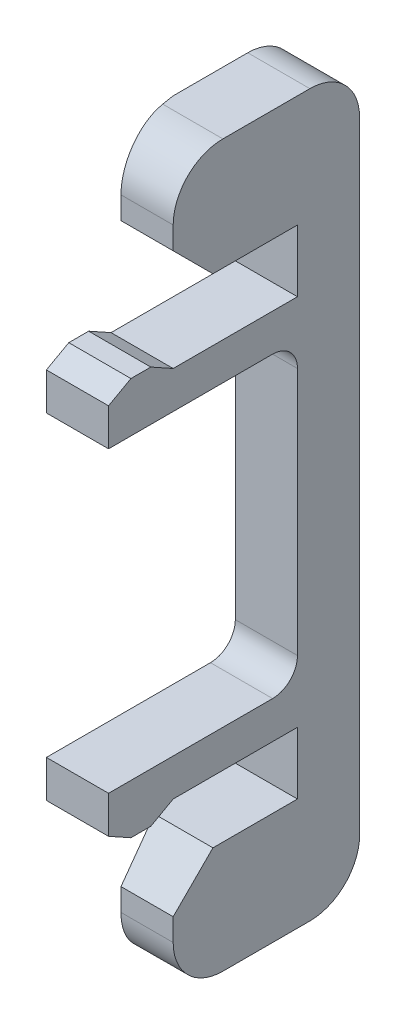
ISO-10303-21;
HEADER;
FILE_DESCRIPTION(('STEP AP214'),'2;1');
FILE_NAME('part.step','',(''),(''),'','','');
FILE_SCHEMA(('AUTOMOTIVE_DESIGN { 1 0 10303 214 1 1 1 1 }'));
ENDSEC;
DATA;
#1=APPLICATION_CONTEXT('core data for automotive mechanical design processes');
#2=APPLICATION_PROTOCOL_DEFINITION('international standard','automotive_design',2000,#1);
#3=PRODUCT_CONTEXT('',#1,'mechanical');
#4=PRODUCT('Part','Part','',(#3));
#5=PRODUCT_RELATED_PRODUCT_CATEGORY('part','',(#4));
#6=PRODUCT_DEFINITION_FORMATION('','',#4);
#7=PRODUCT_DEFINITION_CONTEXT('part definition',#1,'design');
#8=PRODUCT_DEFINITION('design','',#6,#7);
#9=PRODUCT_DEFINITION_SHAPE('','',#8);
#10=(LENGTH_UNIT() NAMED_UNIT(*) SI_UNIT(.MILLI.,.METRE.));
#11=(NAMED_UNIT(*) PLANE_ANGLE_UNIT() SI_UNIT($,.RADIAN.));
#12=(NAMED_UNIT(*) SI_UNIT($,.STERADIAN.) SOLID_ANGLE_UNIT());
#13=UNCERTAINTY_MEASURE_WITH_UNIT(LENGTH_MEASURE(1.E-05),#10,'distance_accuracy_value','');
#14=(GEOMETRIC_REPRESENTATION_CONTEXT(3) GLOBAL_UNCERTAINTY_ASSIGNED_CONTEXT((#13)) GLOBAL_UNIT_ASSIGNED_CONTEXT((#10,
#11,#12)) REPRESENTATION_CONTEXT('',''));
#15=CARTESIAN_POINT('',(0.,0.,0.));
#16=DIRECTION('',(0.,0.,1.));
#17=DIRECTION('',(1.,0.,0.));
#18=AXIS2_PLACEMENT_3D('',#15,#16,#17);
#19=CARTESIAN_POINT('',(-1.5875,-18.415,3.175));
#20=DIRECTION('',(1.,0.,0.));
#21=DIRECTION('',(0.,0.,-1.));
#22=AXIS2_PLACEMENT_3D('',#19,#20,#21);
#23=PLANE('',#22);
#24=DIRECTION('',(0.,-1.,0.));
#25=VECTOR('',#24,1.);
#26=CARTESIAN_POINT('',(-1.5875,18.416,6.35));
#27=LINE('',#26,#25);
#28=CARTESIAN_POINT('',(-1.5875,-12.7,6.35));
#29=VERTEX_POINT('',#28);
#30=CARTESIAN_POINT('',(-1.5875,-18.415,6.35));
#31=VERTEX_POINT('',#30);
#32=EDGE_CURVE('E274',#29,#31,#27,.T.);
#33=ORIENTED_EDGE('',*,*,#32,.F.);
#34=DIRECTION('',(0.,0.,-1.));
#35=VECTOR('',#34,1.);
#36=CARTESIAN_POINT('',(-1.5875,-12.7,3.175));
#37=LINE('',#36,#35);
#38=CARTESIAN_POINT('',(-1.5875,-12.7,3.175));
#39=VERTEX_POINT('',#38);
#40=EDGE_CURVE('E491',#29,#39,#37,.T.);
#41=ORIENTED_EDGE('',*,*,#40,.T.);
#42=DIRECTION('',(0.,-1.,0.));
#43=VECTOR('',#42,1.);
#44=CARTESIAN_POINT('',(-1.5875,-18.415,3.175));
#45=LINE('',#44,#43);
#46=CARTESIAN_POINT('',(-1.5875,-9.525,3.175));
#47=VERTEX_POINT('',#46);
#48=EDGE_CURVE('E513',#47,#39,#45,.T.);
#49=ORIENTED_EDGE('',*,*,#48,.F.);
#50=DIRECTION('',(0.,0.,1.));
#51=VECTOR('',#50,1.);
#52=CARTESIAN_POINT('',(-1.5875,-9.525,3.175));
#53=LINE('',#52,#51);
#54=CARTESIAN_POINT('',(-1.5875,-9.525,9.525));
#55=VERTEX_POINT('',#54);
#56=EDGE_CURVE('E380',#47,#55,#53,.T.);
#57=ORIENTED_EDGE('',*,*,#56,.T.);
#58=DIRECTION('',(0.,-0.485642931178632,0.874157276121538));
#59=VECTOR('',#58,1.);
#60=CARTESIAN_POINT('',(-1.5875,-9.525,9.525));
#61=LINE('',#60,#59);
#62=CARTESIAN_POINT('',(-1.5875,-10.16,10.668));
#63=VERTEX_POINT('',#62);
#64=EDGE_CURVE('E463',#55,#63,#61,.T.);
#65=ORIENTED_EDGE('',*,*,#64,.T.);
#66=DIRECTION('',(0.,0.,1.));
#67=VECTOR('',#66,1.);
#68=CARTESIAN_POINT('',(-1.5875,-10.16,10.668));
#69=LINE('',#68,#67);
#70=CARTESIAN_POINT('',(-1.5875,-10.16,11.684));
#71=VERTEX_POINT('',#70);
#72=EDGE_CURVE('E459',#63,#71,#69,.T.);
#73=ORIENTED_EDGE('',*,*,#72,.T.);
#74=DIRECTION('',(0.,0.485642931178633,0.874157276121537));
#75=VECTOR('',#74,1.);
#76=CARTESIAN_POINT('',(-1.5875,-10.16,11.684));
#77=LINE('',#76,#75);
#78=CARTESIAN_POINT('',(-1.5875,-9.525,12.827));
#79=VERTEX_POINT('',#78);
#80=EDGE_CURVE('E455',#71,#79,#77,.T.);
#81=ORIENTED_EDGE('',*,*,#80,.T.);
#82=DIRECTION('',(0.,1.,0.));
#83=VECTOR('',#82,1.);
#84=CARTESIAN_POINT('',(-1.5875,-9.525,12.827));
#85=LINE('',#84,#83);
#86=CARTESIAN_POINT('',(-1.5875,-7.62,12.827));
#87=VERTEX_POINT('',#86);
#88=EDGE_CURVE('E451',#79,#87,#85,.T.);
#89=ORIENTED_EDGE('',*,*,#88,.T.);
#90=DIRECTION('',(0.,0.,-1.));
#91=VECTOR('',#90,1.);
#92=CARTESIAN_POINT('',(-1.5875,-7.62,12.827));
#93=LINE('',#92,#91);
#94=CARTESIAN_POINT('',(-1.5875,-7.62,4.445));
#95=VERTEX_POINT('',#94);
#96=EDGE_CURVE('E431',#87,#95,#93,.T.);
#97=ORIENTED_EDGE('',*,*,#96,.T.);
#98=CARTESIAN_POINT('',(-1.5875,-6.35,4.445));
#99=DIRECTION('',(1.,0.,0.));
#100=DIRECTION('',(0.,0.,-1.));
#101=AXIS2_PLACEMENT_3D('',#98,#99,#100);
#102=CIRCLE('',#101,1.27);
#103=CARTESIAN_POINT('',(-1.5875,-6.35,3.175));
#104=VERTEX_POINT('',#103);
#105=EDGE_CURVE('E555',#95,#104,#102,.T.);
#106=ORIENTED_EDGE('',*,*,#105,.T.);
#107=CARTESIAN_POINT('',(-1.5875,6.35,3.175));
#108=VERTEX_POINT('',#107);
#109=EDGE_CURVE('E520',#108,#104,#45,.T.);
#110=ORIENTED_EDGE('',*,*,#109,.F.);
#111=CARTESIAN_POINT('',(-1.5875,6.35,4.445));
#112=DIRECTION('',(1.,0.,0.));
#113=DIRECTION('',(0.,0.,-1.));
#114=AXIS2_PLACEMENT_3D('',#111,#112,#113);
#115=CIRCLE('',#114,1.27);
#116=CARTESIAN_POINT('',(-1.5875,7.62,4.445));
#117=VERTEX_POINT('',#116);
#118=EDGE_CURVE('E561',#108,#117,#115,.T.);
#119=ORIENTED_EDGE('',*,*,#118,.T.);
#120=DIRECTION('',(0.,0.,1.));
#121=VECTOR('',#120,1.);
#122=CARTESIAN_POINT('',(-1.5875,7.62,12.827));
#123=LINE('',#122,#121);
#124=CARTESIAN_POINT('',(-1.5875,7.62,12.827));
#125=VERTEX_POINT('',#124);
#126=EDGE_CURVE('E376',#117,#125,#123,.T.);
#127=ORIENTED_EDGE('',*,*,#126,.T.);
#128=DIRECTION('',(0.,1.,0.));
#129=VECTOR('',#128,1.);
#130=CARTESIAN_POINT('',(-1.5875,9.525,12.827));
#131=LINE('',#130,#129);
#132=CARTESIAN_POINT('',(-1.5875,9.525,12.827));
#133=VERTEX_POINT('',#132);
#134=EDGE_CURVE('E379',#125,#133,#131,.T.);
#135=ORIENTED_EDGE('',*,*,#134,.T.);
#136=DIRECTION('',(0.,0.485642931178633,-0.874157276121537));
#137=VECTOR('',#136,1.);
#138=CARTESIAN_POINT('',(-1.5875,10.16,11.684));
#139=LINE('',#138,#137);
#140=CARTESIAN_POINT('',(-1.5875,10.16,11.684));
#141=VERTEX_POINT('',#140);
#142=EDGE_CURVE('E384',#133,#141,#139,.T.);
#143=ORIENTED_EDGE('',*,*,#142,.T.);
#144=DIRECTION('',(0.,0.,-1.));
#145=VECTOR('',#144,1.);
#146=CARTESIAN_POINT('',(-1.5875,10.16,10.668));
#147=LINE('',#146,#145);
#148=CARTESIAN_POINT('',(-1.5875,10.16,10.668));
#149=VERTEX_POINT('',#148);
#150=EDGE_CURVE('E388',#141,#149,#147,.T.);
#151=ORIENTED_EDGE('',*,*,#150,.T.);
#152=DIRECTION('',(0.,-0.485642931178632,-0.874157276121538));
#153=VECTOR('',#152,1.);
#154=CARTESIAN_POINT('',(-1.5875,9.525,9.525));
#155=LINE('',#154,#153);
#156=CARTESIAN_POINT('',(-1.5875,9.525,9.525));
#157=VERTEX_POINT('',#156);
#158=EDGE_CURVE('E392',#149,#157,#155,.T.);
#159=ORIENTED_EDGE('',*,*,#158,.T.);
#160=DIRECTION('',(0.,0.,-1.));
#161=VECTOR('',#160,1.);
#162=CARTESIAN_POINT('',(-1.5875,9.525,3.175));
#163=LINE('',#162,#161);
#164=CARTESIAN_POINT('',(-1.5875,9.525,3.175));
#165=VERTEX_POINT('',#164);
#166=EDGE_CURVE('E396',#157,#165,#163,.T.);
#167=ORIENTED_EDGE('',*,*,#166,.T.);
#168=CARTESIAN_POINT('',(-1.5875,12.7,3.175));
#169=VERTEX_POINT('',#168);
#170=EDGE_CURVE('E516',#169,#165,#45,.T.);
#171=ORIENTED_EDGE('',*,*,#170,.F.);
#172=DIRECTION('',(0.,0.,1.));
#173=VECTOR('',#172,1.);
#174=CARTESIAN_POINT('',(-1.5875,12.7,3.175));
#175=LINE('',#174,#173);
#176=CARTESIAN_POINT('',(-1.5875,12.7,6.34999999999997));
#177=VERTEX_POINT('',#176);
#178=EDGE_CURVE('E488',#169,#177,#175,.T.);
#179=ORIENTED_EDGE('',*,*,#178,.T.);
#180=DIRECTION('',(0.,1.,0.));
#181=VECTOR('',#180,1.);
#182=CARTESIAN_POINT('',(-1.5875,-18.416,6.35));
#183=LINE('',#182,#181);
#184=CARTESIAN_POINT('',(-1.5875,18.415,6.35));
#185=VERTEX_POINT('',#184);
#186=EDGE_CURVE('E344',#177,#185,#183,.T.);
#187=ORIENTED_EDGE('',*,*,#186,.T.);
#188=DIRECTION('',(0.,0.,-1.));
#189=VECTOR('',#188,1.);
#190=CARTESIAN_POINT('',(-1.5875,18.415,3.175));
#191=LINE('',#190,#189);
#192=CARTESIAN_POINT('',(-1.5875,18.415,2.54));
#193=VERTEX_POINT('',#192);
#194=EDGE_CURVE('E534',#185,#193,#191,.T.);
#195=ORIENTED_EDGE('',*,*,#194,.T.);
#196=CARTESIAN_POINT('',(-1.5875,15.875,2.54));
#197=DIRECTION('',(1.,0.,0.));
#198=DIRECTION('',(0.,0.,-1.));
#199=AXIS2_PLACEMENT_3D('',#196,#197,#198);
#200=CIRCLE('',#199,2.54);
#201=CARTESIAN_POINT('',(-1.5875,15.875,0.));
#202=VERTEX_POINT('',#201);
#203=EDGE_CURVE('E281',#193,#202,#200,.F.);
#204=ORIENTED_EDGE('',*,*,#203,.T.);
#205=DIRECTION('',(0.,-1.,0.));
#206=VECTOR('',#205,1.);
#207=CARTESIAN_POINT('',(-1.5875,-18.415,0.));
#208=LINE('',#207,#206);
#209=CARTESIAN_POINT('',(-1.5875,-15.875,0.));
#210=VERTEX_POINT('',#209);
#211=EDGE_CURVE('E524',#202,#210,#208,.T.);
#212=ORIENTED_EDGE('',*,*,#211,.T.);
#213=CARTESIAN_POINT('',(-1.5875,-15.875,2.54));
#214=DIRECTION('',(1.,0.,0.));
#215=DIRECTION('',(0.,0.,-1.));
#216=AXIS2_PLACEMENT_3D('',#213,#214,#215);
#217=CIRCLE('',#216,2.54);
#218=CARTESIAN_POINT('',(-1.5875,-18.415,2.54));
#219=VERTEX_POINT('',#218);
#220=EDGE_CURVE('E287',#210,#219,#217,.F.);
#221=ORIENTED_EDGE('',*,*,#220,.T.);
#222=DIRECTION('',(0.,0.,-1.));
#223=VECTOR('',#222,1.);
#224=CARTESIAN_POINT('',(-1.5875,-18.415,3.175));
#225=LINE('',#224,#223);
#226=EDGE_CURVE('E531',#31,#219,#225,.T.);
#227=ORIENTED_EDGE('',*,*,#226,.F.);
#228=EDGE_LOOP('',(#33,#41,#49,#57,#65,#73,#81,#89,#97,#106,#110,#119,#127,#135,#143,#151,#159,
#167,#171,#179,#187,#195,#204,#212,#221,#227));
#229=FACE_BOUND('',#228,.T.);
#230=ADVANCED_FACE('F47',(#229),#23,.F.);
#231=CARTESIAN_POINT('',(-1.5875,-18.415,3.175));
#232=DIRECTION('',(0.,1.,0.));
#233=DIRECTION('',(0.,0.,1.));
#234=AXIS2_PLACEMENT_3D('',#231,#232,#233);
#235=PLANE('',#234);
#236=DIRECTION('',(-0.157990501106673,0.,-0.987440631916705));
#237=VECTOR('',#236,1.);
#238=CARTESIAN_POINT('',(-1.5875,-18.415,6.35));
#239=LINE('',#238,#237);
#240=CARTESIAN_POINT('',(-1.4859,-18.415,6.985));
#241=VERTEX_POINT('',#240);
#242=EDGE_CURVE('E258',#241,#31,#239,.T.);
#243=ORIENTED_EDGE('',*,*,#242,.T.);
#244=ORIENTED_EDGE('',*,*,#226,.T.);
#245=DIRECTION('',(1.,0.,0.));
#246=VECTOR('',#245,1.);
#247=CARTESIAN_POINT('',(1.5875,-18.415,2.54));
#248=LINE('',#247,#246);
#249=CARTESIAN_POINT('',(1.5875,-18.415,2.54));
#250=VERTEX_POINT('',#249);
#251=EDGE_CURVE('E567',#219,#250,#248,.T.);
#252=ORIENTED_EDGE('',*,*,#251,.T.);
#253=DIRECTION('',(0.,0.,-1.));
#254=VECTOR('',#253,1.);
#255=CARTESIAN_POINT('',(1.5875,-18.415,3.175));
#256=LINE('',#255,#254);
#257=CARTESIAN_POINT('',(1.5875,-18.415,6.985));
#258=VERTEX_POINT('',#257);
#259=EDGE_CURVE('E519',#258,#250,#256,.T.);
#260=ORIENTED_EDGE('',*,*,#259,.F.);
#261=DIRECTION('',(-1.,0.,0.));
#262=VECTOR('',#261,1.);
#263=CARTESIAN_POINT('',(-1.5875,-18.415,6.985));
#264=LINE('',#263,#262);
#265=EDGE_CURVE('E571',#258,#241,#264,.T.);
#266=ORIENTED_EDGE('',*,*,#265,.T.);
#267=EDGE_LOOP('',(#243,#244,#252,#260,#266));
#268=FACE_BOUND('',#267,.T.);
#269=ADVANCED_FACE('F586',(#268),#235,.F.);
#270=CARTESIAN_POINT('',(10.1305512698918,-12.7,3.175));
#271=DIRECTION('',(0.,1.,0.));
#272=DIRECTION('',(0.,0.,1.));
#273=AXIS2_PLACEMENT_3D('',#270,#271,#272);
#274=PLANE('',#273);
#275=ORIENTED_EDGE('',*,*,#40,.F.);
#276=DIRECTION('',(-0.157990501106673,0.,-0.987440631916706));
#277=VECTOR('',#276,1.);
#278=CARTESIAN_POINT('',(-1.5875,-12.7,6.35));
#279=LINE('',#278,#277);
#280=CARTESIAN_POINT('',(-1.40462,-12.7,7.49299999999999));
#281=VERTEX_POINT('',#280);
#282=EDGE_CURVE('E358',#281,#29,#279,.T.);
#283=ORIENTED_EDGE('',*,*,#282,.F.);
#284=DIRECTION('',(1.,0.,0.));
#285=VECTOR('',#284,1.);
#286=CARTESIAN_POINT('',(10.1305512698918,-12.7,7.49299999999999));
#287=LINE('',#286,#285);
#288=CARTESIAN_POINT('',(1.5875,-12.7,7.49299999999999));
#289=VERTEX_POINT('',#288);
#290=EDGE_CURVE('E317',#281,#289,#287,.T.);
#291=ORIENTED_EDGE('',*,*,#290,.T.);
#292=DIRECTION('',(0.,0.,1.));
#293=VECTOR('',#292,1.);
#294=CARTESIAN_POINT('',(1.5875,-12.7,3.175));
#295=LINE('',#294,#293);
#296=CARTESIAN_POINT('',(1.5875,-12.7,3.175));
#297=VERTEX_POINT('',#296);
#298=EDGE_CURVE('E422',#297,#289,#295,.T.);
#299=ORIENTED_EDGE('',*,*,#298,.F.);
#300=DIRECTION('',(-1.,0.,0.));
#301=VECTOR('',#300,1.);
#302=CARTESIAN_POINT('',(10.1305512698918,-12.7,3.175));
#303=LINE('',#302,#301);
#304=EDGE_CURVE('E498',#297,#39,#303,.T.);
#305=ORIENTED_EDGE('',*,*,#304,.T.);
#306=EDGE_LOOP('',(#275,#283,#291,#299,#305));
#307=FACE_BOUND('',#306,.T.);
#308=ADVANCED_FACE('F607',(#307),#274,.T.);
#309=CARTESIAN_POINT('',(10.1305512698918,-18.415,9.525));
#310=DIRECTION('',(0.,0.,1.));
#311=DIRECTION('',(1.,0.,0.));
#312=AXIS2_PLACEMENT_3D('',#309,#310,#311);
#313=PLANE('',#312);
#314=DIRECTION('',(-1.,0.,0.));
#315=VECTOR('',#314,1.);
#316=CARTESIAN_POINT('',(10.1305512698918,-14.732,9.525));
#317=LINE('',#316,#315);
#318=CARTESIAN_POINT('',(1.5875,-14.732,9.525));
#319=VERTEX_POINT('',#318);
#320=CARTESIAN_POINT('',(-1.0795,-14.732,9.525));
#321=VERTEX_POINT('',#320);
#322=EDGE_CURVE('E272',#319,#321,#317,.T.);
#323=ORIENTED_EDGE('',*,*,#322,.T.);
#324=DIRECTION('',(0.,-1.,0.));
#325=VECTOR('',#324,1.);
#326=CARTESIAN_POINT('',(-1.0795,18.416,9.525));
#327=LINE('',#326,#325);
#328=CARTESIAN_POINT('',(-1.0795,-15.875,9.525));
#329=VERTEX_POINT('',#328);
#330=EDGE_CURVE('E64',#321,#329,#327,.T.);
#331=ORIENTED_EDGE('',*,*,#330,.T.);
#332=DIRECTION('',(-1.,0.,0.));
#333=VECTOR('',#332,1.);
#334=CARTESIAN_POINT('',(1.5875,-15.875,9.525));
#335=LINE('',#334,#333);
#336=CARTESIAN_POINT('',(1.5875,-15.875,9.525));
#337=VERTEX_POINT('',#336);
#338=EDGE_CURVE('E269',#329,#337,#335,.F.);
#339=ORIENTED_EDGE('',*,*,#338,.T.);
#340=DIRECTION('',(0.,-1.,0.));
#341=VECTOR('',#340,1.);
#342=CARTESIAN_POINT('',(1.5875,-18.415,9.525));
#343=LINE('',#342,#341);
#344=EDGE_CURVE('E502',#319,#337,#343,.T.);
#345=ORIENTED_EDGE('',*,*,#344,.F.);
#346=EDGE_LOOP('',(#323,#331,#339,#345));
#347=FACE_BOUND('',#346,.T.);
#348=ADVANCED_FACE('F267',(#347),#313,.T.);
#349=CARTESIAN_POINT('',(-1.5875,-15.875,6.985));
#350=DIRECTION('',(1.,0.,0.));
#351=DIRECTION('',(0.,0.,-1.));
#352=AXIS2_PLACEMENT_3D('',#349,#350,#351);
#353=CYLINDRICAL_SURFACE('',#352,2.54);
#354=ORIENTED_EDGE('',*,*,#338,.F.);
#355=CARTESIAN_POINT('',(-1.4859,-15.875,6.985));
#356=DIRECTION('',(-0.987440631916705,0.,0.157990501106673));
#357=DIRECTION('',(0.157990501106673,0.,0.987440631916706));
#358=AXIS2_PLACEMENT_3D('',#355,#356,#357);
#359=ELLIPSE('',#358,2.57230654471818,2.54);
#360=EDGE_CURVE('E255',#241,#329,#359,.T.);
#361=ORIENTED_EDGE('',*,*,#360,.F.);
#362=ORIENTED_EDGE('',*,*,#265,.F.);
#363=CARTESIAN_POINT('',(1.5875,-15.875,6.985));
#364=DIRECTION('',(-1.,0.,0.));
#365=DIRECTION('',(0.,0.,1.));
#366=AXIS2_PLACEMENT_3D('',#363,#364,#365);
#367=CIRCLE('',#366,2.54);
#368=EDGE_CURVE('E278',#337,#258,#367,.F.);
#369=ORIENTED_EDGE('',*,*,#368,.F.);
#370=EDGE_LOOP('',(#354,#361,#362,#369));
#371=FACE_BOUND('',#370,.T.);
#372=ADVANCED_FACE('F277',(#371),#353,.T.);
#373=CARTESIAN_POINT('',(10.1305512698918,-14.732,9.525));
#374=DIRECTION('',(0.,-0.707106781186549,-0.707106781186546));
#375=DIRECTION('',(-1.,0.,0.));
#376=AXIS2_PLACEMENT_3D('',#373,#374,#375);
#377=PLANE('',#376);
#378=ORIENTED_EDGE('',*,*,#290,.F.);
#379=DIRECTION('',(0.112419885463869,-0.702624284149177,0.70262428414918));
#380=VECTOR('',#379,1.);
#381=CARTESIAN_POINT('',(-3.9550355450237,3.24009715639805,-8.44709715639811));
#382=LINE('',#381,#380);
#383=EDGE_CURVE('E594',#321,#281,#382,.F.);
#384=ORIENTED_EDGE('',*,*,#383,.F.);
#385=ORIENTED_EDGE('',*,*,#322,.F.);
#386=DIRECTION('',(0.,0.707106781186546,-0.707106781186549));
#387=VECTOR('',#386,1.);
#388=CARTESIAN_POINT('',(1.5875,-14.732,9.525));
#389=LINE('',#388,#387);
#390=EDGE_CURVE('E323',#289,#319,#389,.F.);
#391=ORIENTED_EDGE('',*,*,#390,.F.);
#392=EDGE_LOOP('',(#378,#384,#385,#391));
#393=FACE_BOUND('',#392,.T.);
#394=ADVANCED_FACE('F593',(#393),#377,.F.);
#395=CARTESIAN_POINT('',(0.,0.,3.175));
#396=DIRECTION('',(0.,0.,-1.));
#397=DIRECTION('',(-1.,0.,0.));
#398=AXIS2_PLACEMENT_3D('',#395,#396,#397);
#399=PLANE('',#398);
#400=ORIENTED_EDGE('',*,*,#170,.T.);
#401=DIRECTION('',(-1.,0.,0.));
#402=VECTOR('',#401,1.);
#403=CARTESIAN_POINT('',(11.5681164138294,9.525,3.175));
#404=LINE('',#403,#402);
#405=CARTESIAN_POINT('',(1.5875,9.525,3.175));
#406=VERTEX_POINT('',#405);
#407=EDGE_CURVE('E363',#406,#165,#404,.T.);
#408=ORIENTED_EDGE('',*,*,#407,.F.);
#409=DIRECTION('',(0.,1.,0.));
#410=VECTOR('',#409,1.);
#411=CARTESIAN_POINT('',(1.5875,-18.415,3.175));
#412=LINE('',#411,#410);
#413=CARTESIAN_POINT('',(1.5875,12.7,3.175));
#414=VERTEX_POINT('',#413);
#415=EDGE_CURVE('E515',#406,#414,#412,.T.);
#416=ORIENTED_EDGE('',*,*,#415,.T.);
#417=DIRECTION('',(-1.,0.,0.));
#418=VECTOR('',#417,1.);
#419=CARTESIAN_POINT('',(10.1305512698918,12.7,3.175));
#420=LINE('',#419,#418);
#421=EDGE_CURVE('E487',#414,#169,#420,.T.);
#422=ORIENTED_EDGE('',*,*,#421,.T.);
#423=EDGE_LOOP('',(#400,#408,#416,#422));
#424=FACE_BOUND('',#423,.T.);
#425=ADVANCED_FACE('F703',(#424),#399,.F.);
#426=ORIENTED_EDGE('',*,*,#109,.T.);
#427=DIRECTION('',(-1.,0.,0.));
#428=VECTOR('',#427,1.);
#429=CARTESIAN_POINT('',(0.,-6.35,3.175));
#430=LINE('',#429,#428);
#431=CARTESIAN_POINT('',(1.5875,-6.35,3.175));
#432=VERTEX_POINT('',#431);
#433=EDGE_CURVE('E549',#104,#432,#430,.F.);
#434=ORIENTED_EDGE('',*,*,#433,.T.);
#435=CARTESIAN_POINT('',(1.5875,6.35,3.175));
#436=VERTEX_POINT('',#435);
#437=EDGE_CURVE('E514',#432,#436,#412,.T.);
#438=ORIENTED_EDGE('',*,*,#437,.T.);
#439=DIRECTION('',(-1.,0.,0.));
#440=VECTOR('',#439,1.);
#441=CARTESIAN_POINT('',(0.,6.35,3.175));
#442=LINE('',#441,#440);
#443=EDGE_CURVE('E545',#436,#108,#442,.T.);
#444=ORIENTED_EDGE('',*,*,#443,.T.);
#445=EDGE_LOOP('',(#426,#434,#438,#444));
#446=FACE_BOUND('',#445,.T.);
#447=ADVANCED_FACE('F626',(#446),#399,.F.);
#448=CARTESIAN_POINT('',(1.5875,-9.525,3.175));
#449=VERTEX_POINT('',#448);
#450=EDGE_CURVE('E510',#297,#449,#412,.T.);
#451=ORIENTED_EDGE('',*,*,#450,.T.);
#452=DIRECTION('',(-1.,0.,0.));
#453=VECTOR('',#452,1.);
#454=CARTESIAN_POINT('',(11.5681164138294,-9.525,3.175));
#455=LINE('',#454,#453);
#456=EDGE_CURVE('E427',#449,#47,#455,.T.);
#457=ORIENTED_EDGE('',*,*,#456,.T.);
#458=ORIENTED_EDGE('',*,*,#48,.T.);
#459=ORIENTED_EDGE('',*,*,#304,.F.);
#460=EDGE_LOOP('',(#451,#457,#458,#459));
#461=FACE_BOUND('',#460,.T.);
#462=ADVANCED_FACE('F611',(#461),#399,.F.);
#463=CARTESIAN_POINT('',(1.5875,-18.415,3.175));
#464=DIRECTION('',(-1.,0.,0.));
#465=DIRECTION('',(0.,0.,1.));
#466=AXIS2_PLACEMENT_3D('',#463,#464,#465);
#467=PLANE('',#466);
#468=ORIENTED_EDGE('',*,*,#298,.T.);
#469=ORIENTED_EDGE('',*,*,#390,.T.);
#470=ORIENTED_EDGE('',*,*,#344,.T.);
#471=ORIENTED_EDGE('',*,*,#368,.T.);
#472=ORIENTED_EDGE('',*,*,#259,.T.);
#473=CARTESIAN_POINT('',(1.5875,-15.875,2.54));
#474=DIRECTION('',(-1.,0.,0.));
#475=DIRECTION('',(0.,0.,1.));
#476=AXIS2_PLACEMENT_3D('',#473,#474,#475);
#477=CIRCLE('',#476,2.54);
#478=CARTESIAN_POINT('',(1.5875,-15.875,0.));
#479=VERTEX_POINT('',#478);
#480=EDGE_CURVE('E280',#250,#479,#477,.F.);
#481=ORIENTED_EDGE('',*,*,#480,.T.);
#482=DIRECTION('',(0.,1.,0.));
#483=VECTOR('',#482,1.);
#484=CARTESIAN_POINT('',(1.5875,-18.415,0.));
#485=LINE('',#484,#483);
#486=CARTESIAN_POINT('',(1.5875,15.875,0.));
#487=VERTEX_POINT('',#486);
#488=EDGE_CURVE('E497',#479,#487,#485,.T.);
#489=ORIENTED_EDGE('',*,*,#488,.T.);
#490=CARTESIAN_POINT('',(1.5875,15.875,2.54));
#491=DIRECTION('',(-1.,0.,0.));
#492=DIRECTION('',(0.,0.,1.));
#493=AXIS2_PLACEMENT_3D('',#490,#491,#492);
#494=CIRCLE('',#493,2.54);
#495=CARTESIAN_POINT('',(1.5875,18.415,2.54));
#496=VERTEX_POINT('',#495);
#497=EDGE_CURVE('E285',#487,#496,#494,.F.);
#498=ORIENTED_EDGE('',*,*,#497,.T.);
#499=DIRECTION('',(0.,0.,-1.));
#500=VECTOR('',#499,1.);
#501=CARTESIAN_POINT('',(1.5875,18.415,3.175));
#502=LINE('',#501,#500);
#503=CARTESIAN_POINT('',(1.5875,18.415,6.985));
#504=VERTEX_POINT('',#503);
#505=EDGE_CURVE('E537',#504,#496,#502,.T.);
#506=ORIENTED_EDGE('',*,*,#505,.F.);
#507=CARTESIAN_POINT('',(1.5875,15.875,6.985));
#508=DIRECTION('',(-1.,0.,0.));
#509=DIRECTION('',(0.,0.,1.));
#510=AXIS2_PLACEMENT_3D('',#507,#508,#509);
#511=CIRCLE('',#510,2.54);
#512=CARTESIAN_POINT('',(1.5875,15.875,9.525));
#513=VERTEX_POINT('',#512);
#514=EDGE_CURVE('E293',#504,#513,#511,.F.);
#515=ORIENTED_EDGE('',*,*,#514,.T.);
#516=DIRECTION('',(0.,-1.,0.));
#517=VECTOR('',#516,1.);
#518=CARTESIAN_POINT('',(1.5875,18.415,9.525));
#519=LINE('',#518,#517);
#520=CARTESIAN_POINT('',(1.5875,14.732,9.525));
#521=VERTEX_POINT('',#520);
#522=EDGE_CURVE('E483',#513,#521,#519,.T.);
#523=ORIENTED_EDGE('',*,*,#522,.T.);
#524=DIRECTION('',(0.,0.707106781186549,0.707106781186546));
#525=VECTOR('',#524,1.);
#526=CARTESIAN_POINT('',(1.5875,12.7,7.493));
#527=LINE('',#526,#525);
#528=CARTESIAN_POINT('',(1.5875,12.7,7.493));
#529=VERTEX_POINT('',#528);
#530=EDGE_CURVE('E320',#521,#529,#527,.F.);
#531=ORIENTED_EDGE('',*,*,#530,.T.);
#532=DIRECTION('',(0.,0.,-1.));
#533=VECTOR('',#532,1.);
#534=CARTESIAN_POINT('',(1.5875,12.7,3.175));
#535=LINE('',#534,#533);
#536=EDGE_CURVE('E333',#529,#414,#535,.T.);
#537=ORIENTED_EDGE('',*,*,#536,.T.);
#538=ORIENTED_EDGE('',*,*,#415,.F.);
#539=DIRECTION('',(0.,0.,1.));
#540=VECTOR('',#539,1.);
#541=CARTESIAN_POINT('',(1.5875,9.525,3.175));
#542=LINE('',#541,#540);
#543=CARTESIAN_POINT('',(1.5875,9.525,9.525));
#544=VERTEX_POINT('',#543);
#545=EDGE_CURVE('E372',#406,#544,#542,.T.);
#546=ORIENTED_EDGE('',*,*,#545,.T.);
#547=DIRECTION('',(0.,0.485642931178632,0.874157276121538));
#548=VECTOR('',#547,1.);
#549=CARTESIAN_POINT('',(1.5875,9.525,9.525));
#550=LINE('',#549,#548);
#551=CARTESIAN_POINT('',(1.5875,10.16,10.668));
#552=VERTEX_POINT('',#551);
#553=EDGE_CURVE('E369',#544,#552,#550,.T.);
#554=ORIENTED_EDGE('',*,*,#553,.T.);
#555=DIRECTION('',(0.,0.,1.));
#556=VECTOR('',#555,1.);
#557=CARTESIAN_POINT('',(1.5875,10.16,10.668));
#558=LINE('',#557,#556);
#559=CARTESIAN_POINT('',(1.5875,10.16,11.684));
#560=VERTEX_POINT('',#559);
#561=EDGE_CURVE('E366',#552,#560,#558,.T.);
#562=ORIENTED_EDGE('',*,*,#561,.T.);
#563=DIRECTION('',(0.,-0.485642931178633,0.874157276121537));
#564=VECTOR('',#563,1.);
#565=CARTESIAN_POINT('',(1.5875,10.16,11.684));
#566=LINE('',#565,#564);
#567=CARTESIAN_POINT('',(1.5875,9.525,12.827));
#568=VERTEX_POINT('',#567);
#569=EDGE_CURVE('E362',#560,#568,#566,.T.);
#570=ORIENTED_EDGE('',*,*,#569,.T.);
#571=DIRECTION('',(0.,-1.,0.));
#572=VECTOR('',#571,1.);
#573=CARTESIAN_POINT('',(1.5875,9.525,12.827));
#574=LINE('',#573,#572);
#575=CARTESIAN_POINT('',(1.5875,7.62,12.827));
#576=VERTEX_POINT('',#575);
#577=EDGE_CURVE('E359',#568,#576,#574,.T.);
#578=ORIENTED_EDGE('',*,*,#577,.T.);
#579=DIRECTION('',(0.,0.,-1.));
#580=VECTOR('',#579,1.);
#581=CARTESIAN_POINT('',(1.5875,7.62,12.827));
#582=LINE('',#581,#580);
#583=CARTESIAN_POINT('',(1.5875,7.62,4.445));
#584=VERTEX_POINT('',#583);
#585=EDGE_CURVE('E375',#576,#584,#582,.T.);
#586=ORIENTED_EDGE('',*,*,#585,.T.);
#587=CARTESIAN_POINT('',(1.5875,6.35,4.445));
#588=DIRECTION('',(-1.,0.,0.));
#589=DIRECTION('',(0.,0.,1.));
#590=AXIS2_PLACEMENT_3D('',#587,#588,#589);
#591=CIRCLE('',#590,1.27);
#592=EDGE_CURVE('E564',#584,#436,#591,.T.);
#593=ORIENTED_EDGE('',*,*,#592,.T.);
#594=ORIENTED_EDGE('',*,*,#437,.F.);
#595=CARTESIAN_POINT('',(1.5875,-6.35,4.445));
#596=DIRECTION('',(-1.,0.,0.));
#597=DIRECTION('',(0.,0.,1.));
#598=AXIS2_PLACEMENT_3D('',#595,#596,#597);
#599=CIRCLE('',#598,1.27);
#600=CARTESIAN_POINT('',(1.5875,-7.62,4.445));
#601=VERTEX_POINT('',#600);
#602=EDGE_CURVE('E558',#432,#601,#599,.T.);
#603=ORIENTED_EDGE('',*,*,#602,.T.);
#604=DIRECTION('',(0.,0.,1.));
#605=VECTOR('',#604,1.);
#606=CARTESIAN_POINT('',(1.5875,-7.62,12.827));
#607=LINE('',#606,#605);
#608=CARTESIAN_POINT('',(1.5875,-7.62,12.827));
#609=VERTEX_POINT('',#608);
#610=EDGE_CURVE('E426',#601,#609,#607,.T.);
#611=ORIENTED_EDGE('',*,*,#610,.T.);
#612=DIRECTION('',(0.,-1.,0.));
#613=VECTOR('',#612,1.);
#614=CARTESIAN_POINT('',(1.5875,-9.525,12.827));
#615=LINE('',#614,#613);
#616=CARTESIAN_POINT('',(1.5875,-9.525,12.827));
#617=VERTEX_POINT('',#616);
#618=EDGE_CURVE('E472',#609,#617,#615,.T.);
#619=ORIENTED_EDGE('',*,*,#618,.T.);
#620=DIRECTION('',(0.,-0.485642931178633,-0.874157276121537));
#621=VECTOR('',#620,1.);
#622=CARTESIAN_POINT('',(1.5875,-10.16,11.684));
#623=LINE('',#622,#621);
#624=CARTESIAN_POINT('',(1.5875,-10.16,11.684));
#625=VERTEX_POINT('',#624);
#626=EDGE_CURVE('E475',#617,#625,#623,.T.);
#627=ORIENTED_EDGE('',*,*,#626,.T.);
#628=DIRECTION('',(0.,0.,-1.));
#629=VECTOR('',#628,1.);
#630=CARTESIAN_POINT('',(1.5875,-10.16,10.668));
#631=LINE('',#630,#629);
#632=CARTESIAN_POINT('',(1.5875,-10.16,10.668));
#633=VERTEX_POINT('',#632);
#634=EDGE_CURVE('E478',#625,#633,#631,.T.);
#635=ORIENTED_EDGE('',*,*,#634,.T.);
#636=DIRECTION('',(0.,0.485642931178632,-0.874157276121538));
#637=VECTOR('',#636,1.);
#638=CARTESIAN_POINT('',(1.5875,-9.525,9.525));
#639=LINE('',#638,#637);
#640=CARTESIAN_POINT('',(1.5875,-9.525,9.525));
#641=VERTEX_POINT('',#640);
#642=EDGE_CURVE('E447',#633,#641,#639,.T.);
#643=ORIENTED_EDGE('',*,*,#642,.T.);
#644=DIRECTION('',(0.,0.,-1.));
#645=VECTOR('',#644,1.);
#646=CARTESIAN_POINT('',(1.5875,-9.525,3.175));
#647=LINE('',#646,#645);
#648=EDGE_CURVE('E354',#641,#449,#647,.T.);
#649=ORIENTED_EDGE('',*,*,#648,.T.);
#650=ORIENTED_EDGE('',*,*,#450,.F.);
#651=EDGE_LOOP('',(#468,#469,#470,#471,#472,#481,#489,#498,#506,#515,#523,#531,#537,#538,#546,
#554,#562,#570,#578,#586,#593,#594,#603,#611,#619,#627,#635,#643,#649,#650));
#652=FACE_BOUND('',#651,.T.);
#653=ADVANCED_FACE('F588',(#652),#467,.F.);
#654=CARTESIAN_POINT('',(-1.5875,18.415,3.175));
#655=DIRECTION('',(0.,-1.,0.));
#656=DIRECTION('',(0.,0.,-1.));
#657=AXIS2_PLACEMENT_3D('',#654,#655,#656);
#658=PLANE('',#657);
#659=ORIENTED_EDGE('',*,*,#194,.F.);
#660=DIRECTION('',(-0.157990501106673,0.,-0.987440631916705));
#661=VECTOR('',#660,1.);
#662=CARTESIAN_POINT('',(-1.5875,18.415,6.35));
#663=LINE('',#662,#661);
#664=CARTESIAN_POINT('',(-1.4859,18.415,6.985));
#665=VERTEX_POINT('',#664);
#666=EDGE_CURVE('E347',#665,#185,#663,.T.);
#667=ORIENTED_EDGE('',*,*,#666,.F.);
#668=DIRECTION('',(-1.,0.,0.));
#669=VECTOR('',#668,1.);
#670=CARTESIAN_POINT('',(1.5875,18.415,6.985));
#671=LINE('',#670,#669);
#672=EDGE_CURVE('E306',#665,#504,#671,.F.);
#673=ORIENTED_EDGE('',*,*,#672,.T.);
#674=ORIENTED_EDGE('',*,*,#505,.T.);
#675=DIRECTION('',(-1.,0.,0.));
#676=VECTOR('',#675,1.);
#677=CARTESIAN_POINT('',(-1.5875,18.415,2.54));
#678=LINE('',#677,#676);
#679=EDGE_CURVE('E302',#496,#193,#678,.T.);
#680=ORIENTED_EDGE('',*,*,#679,.T.);
#681=EDGE_LOOP('',(#659,#667,#673,#674,#680));
#682=FACE_BOUND('',#681,.T.);
#683=ADVANCED_FACE('F674',(#682),#658,.F.);
#684=CARTESIAN_POINT('',(0.,0.,0.));
#685=DIRECTION('',(0.,0.,-1.));
#686=DIRECTION('',(-1.,0.,0.));
#687=AXIS2_PLACEMENT_3D('',#684,#685,#686);
#688=PLANE('',#687);
#689=ORIENTED_EDGE('',*,*,#211,.F.);
#690=DIRECTION('',(-1.,0.,0.));
#691=VECTOR('',#690,1.);
#692=CARTESIAN_POINT('',(1.5875,15.875,0.));
#693=LINE('',#692,#691);
#694=EDGE_CURVE('E312',#202,#487,#693,.F.);
#695=ORIENTED_EDGE('',*,*,#694,.T.);
#696=ORIENTED_EDGE('',*,*,#488,.F.);
#697=DIRECTION('',(1.,0.,0.));
#698=VECTOR('',#697,1.);
#699=CARTESIAN_POINT('',(-1.5875,-15.875,0.));
#700=LINE('',#699,#698);
#701=EDGE_CURVE('E309',#479,#210,#700,.F.);
#702=ORIENTED_EDGE('',*,*,#701,.T.);
#703=EDGE_LOOP('',(#689,#695,#696,#702));
#704=FACE_BOUND('',#703,.T.);
#705=ADVANCED_FACE('F677',(#704),#688,.T.);
#706=CARTESIAN_POINT('',(10.1305512698918,18.415,9.525));
#707=DIRECTION('',(0.,0.,1.));
#708=DIRECTION('',(1.,0.,0.));
#709=AXIS2_PLACEMENT_3D('',#706,#707,#708);
#710=PLANE('',#709);
#711=DIRECTION('',(0.,1.,0.));
#712=VECTOR('',#711,1.);
#713=CARTESIAN_POINT('',(-1.0795,-18.416,9.525));
#714=LINE('',#713,#712);
#715=CARTESIAN_POINT('',(-1.0795,14.732,9.525));
#716=VERTEX_POINT('',#715);
#717=CARTESIAN_POINT('',(-1.0795,15.875,9.525));
#718=VERTEX_POINT('',#717);
#719=EDGE_CURVE('E355',#716,#718,#714,.T.);
#720=ORIENTED_EDGE('',*,*,#719,.F.);
#721=DIRECTION('',(1.,0.,0.));
#722=VECTOR('',#721,1.);
#723=CARTESIAN_POINT('',(10.1305512698918,14.732,9.525));
#724=LINE('',#723,#722);
#725=EDGE_CURVE('E11',#716,#521,#724,.T.);
#726=ORIENTED_EDGE('',*,*,#725,.T.);
#727=ORIENTED_EDGE('',*,*,#522,.F.);
#728=DIRECTION('',(-1.,0.,0.));
#729=VECTOR('',#728,1.);
#730=CARTESIAN_POINT('',(-1.5875,15.875,9.525));
#731=LINE('',#730,#729);
#732=EDGE_CURVE('E298',#513,#718,#731,.T.);
#733=ORIENTED_EDGE('',*,*,#732,.T.);
#734=EDGE_LOOP('',(#720,#726,#727,#733));
#735=FACE_BOUND('',#734,.T.);
#736=ADVANCED_FACE('F917',(#735),#710,.T.);
#737=CARTESIAN_POINT('',(10.1305512698918,12.7,3.175));
#738=DIRECTION('',(0.,-1.,0.));
#739=DIRECTION('',(0.,0.,-1.));
#740=AXIS2_PLACEMENT_3D('',#737,#738,#739);
#741=PLANE('',#740);
#742=DIRECTION('',(-0.157990501106673,0.,-0.987440631916706));
#743=VECTOR('',#742,1.);
#744=CARTESIAN_POINT('',(-1.5875,12.7,6.35));
#745=LINE('',#744,#743);
#746=CARTESIAN_POINT('',(-1.40462,12.7,7.493));
#747=VERTEX_POINT('',#746);
#748=EDGE_CURVE('E72',#747,#177,#745,.T.);
#749=ORIENTED_EDGE('',*,*,#748,.T.);
#750=ORIENTED_EDGE('',*,*,#178,.F.);
#751=ORIENTED_EDGE('',*,*,#421,.F.);
#752=ORIENTED_EDGE('',*,*,#536,.F.);
#753=DIRECTION('',(-1.,0.,0.));
#754=VECTOR('',#753,1.);
#755=CARTESIAN_POINT('',(10.1305512698918,12.7,7.493));
#756=LINE('',#755,#754);
#757=EDGE_CURVE('E57',#529,#747,#756,.T.);
#758=ORIENTED_EDGE('',*,*,#757,.T.);
#759=EDGE_LOOP('',(#749,#750,#751,#752,#758));
#760=FACE_BOUND('',#759,.T.);
#761=ADVANCED_FACE('F330',(#760),#741,.T.);
#762=CARTESIAN_POINT('',(11.5681164138294,-7.62,12.827));
#763=DIRECTION('',(0.,1.,0.));
#764=DIRECTION('',(0.,0.,1.));
#765=AXIS2_PLACEMENT_3D('',#762,#763,#764);
#766=PLANE('',#765);
#767=ORIENTED_EDGE('',*,*,#610,.F.);
#768=DIRECTION('',(-1.,0.,0.));
#769=VECTOR('',#768,1.);
#770=CARTESIAN_POINT('',(11.5681164138294,-7.62,4.445));
#771=LINE('',#770,#769);
#772=EDGE_CURVE('E541',#601,#95,#771,.T.);
#773=ORIENTED_EDGE('',*,*,#772,.T.);
#774=ORIENTED_EDGE('',*,*,#96,.F.);
#775=DIRECTION('',(-1.,0.,0.));
#776=VECTOR('',#775,1.);
#777=CARTESIAN_POINT('',(11.5681164138294,-7.62,12.827));
#778=LINE('',#777,#776);
#779=EDGE_CURVE('E444',#609,#87,#778,.T.);
#780=ORIENTED_EDGE('',*,*,#779,.F.);
#781=EDGE_LOOP('',(#767,#773,#774,#780));
#782=FACE_BOUND('',#781,.T.);
#783=ADVANCED_FACE('F638',(#782),#766,.T.);
#784=CARTESIAN_POINT('',(11.5681164138294,-9.525,12.827));
#785=DIRECTION('',(0.,0.,1.));
#786=DIRECTION('',(1.,0.,0.));
#787=AXIS2_PLACEMENT_3D('',#784,#785,#786);
#788=PLANE('',#787);
#789=ORIENTED_EDGE('',*,*,#618,.F.);
#790=ORIENTED_EDGE('',*,*,#779,.T.);
#791=ORIENTED_EDGE('',*,*,#88,.F.);
#792=DIRECTION('',(-1.,0.,0.));
#793=VECTOR('',#792,1.);
#794=CARTESIAN_POINT('',(11.5681164138294,-9.525,12.827));
#795=LINE('',#794,#793);
#796=EDGE_CURVE('E441',#617,#79,#795,.T.);
#797=ORIENTED_EDGE('',*,*,#796,.F.);
#798=EDGE_LOOP('',(#789,#790,#791,#797));
#799=FACE_BOUND('',#798,.T.);
#800=ADVANCED_FACE('F642',(#799),#788,.T.);
#801=CARTESIAN_POINT('',(11.5681164138294,-10.16,11.684));
#802=DIRECTION('',(0.,-0.874157276121537,0.485642931178633));
#803=DIRECTION('',(0.,-0.485642931178633,-0.874157276121537));
#804=AXIS2_PLACEMENT_3D('',#801,#802,#803);
#805=PLANE('',#804);
#806=ORIENTED_EDGE('',*,*,#626,.F.);
#807=ORIENTED_EDGE('',*,*,#796,.T.);
#808=ORIENTED_EDGE('',*,*,#80,.F.);
#809=DIRECTION('',(-1.,0.,0.));
#810=VECTOR('',#809,1.);
#811=CARTESIAN_POINT('',(11.5681164138294,-10.16,11.684));
#812=LINE('',#811,#810);
#813=EDGE_CURVE('E438',#625,#71,#812,.T.);
#814=ORIENTED_EDGE('',*,*,#813,.F.);
#815=EDGE_LOOP('',(#806,#807,#808,#814));
#816=FACE_BOUND('',#815,.T.);
#817=ADVANCED_FACE('F649',(#816),#805,.T.);
#818=CARTESIAN_POINT('',(11.5681164138294,-10.16,10.668));
#819=DIRECTION('',(0.,-1.,0.));
#820=DIRECTION('',(0.,0.,-1.));
#821=AXIS2_PLACEMENT_3D('',#818,#819,#820);
#822=PLANE('',#821);
#823=ORIENTED_EDGE('',*,*,#634,.F.);
#824=ORIENTED_EDGE('',*,*,#813,.T.);
#825=ORIENTED_EDGE('',*,*,#72,.F.);
#826=DIRECTION('',(-1.,0.,0.));
#827=VECTOR('',#826,1.);
#828=CARTESIAN_POINT('',(11.5681164138294,-10.16,10.668));
#829=LINE('',#828,#827);
#830=EDGE_CURVE('E435',#633,#63,#829,.T.);
#831=ORIENTED_EDGE('',*,*,#830,.F.);
#832=EDGE_LOOP('',(#823,#824,#825,#831));
#833=FACE_BOUND('',#832,.T.);
#834=ADVANCED_FACE('F653',(#833),#822,.T.);
#835=CARTESIAN_POINT('',(11.5681164138294,-9.525,9.525));
#836=DIRECTION('',(0.,-0.874157276121538,-0.485642931178632));
#837=DIRECTION('',(0.,0.485642931178632,-0.874157276121538));
#838=AXIS2_PLACEMENT_3D('',#835,#836,#837);
#839=PLANE('',#838);
#840=ORIENTED_EDGE('',*,*,#642,.F.);
#841=ORIENTED_EDGE('',*,*,#830,.T.);
#842=ORIENTED_EDGE('',*,*,#64,.F.);
#843=DIRECTION('',(-1.,0.,0.));
#844=VECTOR('',#843,1.);
#845=CARTESIAN_POINT('',(11.5681164138294,-9.525,9.525));
#846=LINE('',#845,#844);
#847=EDGE_CURVE('E432',#641,#55,#846,.T.);
#848=ORIENTED_EDGE('',*,*,#847,.F.);
#849=EDGE_LOOP('',(#840,#841,#842,#848));
#850=FACE_BOUND('',#849,.T.);
#851=ADVANCED_FACE('F655',(#850),#839,.T.);
#852=CARTESIAN_POINT('',(11.5681164138294,-9.525,3.175));
#853=DIRECTION('',(0.,-1.,0.));
#854=DIRECTION('',(0.,0.,-1.));
#855=AXIS2_PLACEMENT_3D('',#852,#853,#854);
#856=PLANE('',#855);
#857=ORIENTED_EDGE('',*,*,#648,.F.);
#858=ORIENTED_EDGE('',*,*,#847,.T.);
#859=ORIENTED_EDGE('',*,*,#56,.F.);
#860=ORIENTED_EDGE('',*,*,#456,.F.);
#861=EDGE_LOOP('',(#857,#858,#859,#860));
#862=FACE_BOUND('',#861,.T.);
#863=ADVANCED_FACE('F618',(#862),#856,.T.);
#864=CARTESIAN_POINT('',(11.5681164138294,9.525,3.175));
#865=DIRECTION('',(0.,1.,0.));
#866=DIRECTION('',(0.,0.,1.));
#867=AXIS2_PLACEMENT_3D('',#864,#865,#866);
#868=PLANE('',#867);
#869=ORIENTED_EDGE('',*,*,#545,.F.);
#870=ORIENTED_EDGE('',*,*,#407,.T.);
#871=ORIENTED_EDGE('',*,*,#166,.F.);
#872=DIRECTION('',(-1.,0.,0.));
#873=VECTOR('',#872,1.);
#874=CARTESIAN_POINT('',(11.5681164138294,9.525,9.525));
#875=LINE('',#874,#873);
#876=EDGE_CURVE('E404',#544,#157,#875,.T.);
#877=ORIENTED_EDGE('',*,*,#876,.F.);
#878=EDGE_LOOP('',(#869,#870,#871,#877));
#879=FACE_BOUND('',#878,.T.);
#880=ADVANCED_FACE('F662',(#879),#868,.T.);
#881=CARTESIAN_POINT('',(11.5681164138294,9.525,9.525));
#882=DIRECTION('',(0.,0.874157276121538,-0.485642931178632));
#883=DIRECTION('',(0.,0.485642931178632,0.874157276121538));
#884=AXIS2_PLACEMENT_3D('',#881,#882,#883);
#885=PLANE('',#884);
#886=ORIENTED_EDGE('',*,*,#553,.F.);
#887=ORIENTED_EDGE('',*,*,#876,.T.);
#888=ORIENTED_EDGE('',*,*,#158,.F.);
#889=DIRECTION('',(-1.,0.,0.));
#890=VECTOR('',#889,1.);
#891=CARTESIAN_POINT('',(11.5681164138294,10.16,10.668));
#892=LINE('',#891,#890);
#893=EDGE_CURVE('E407',#552,#149,#892,.T.);
#894=ORIENTED_EDGE('',*,*,#893,.F.);
#895=EDGE_LOOP('',(#886,#887,#888,#894));
#896=FACE_BOUND('',#895,.T.);
#897=ADVANCED_FACE('F758',(#896),#885,.T.);
#898=CARTESIAN_POINT('',(11.5681164138294,10.16,10.668));
#899=DIRECTION('',(0.,1.,0.));
#900=DIRECTION('',(0.,0.,1.));
#901=AXIS2_PLACEMENT_3D('',#898,#899,#900);
#902=PLANE('',#901);
#903=ORIENTED_EDGE('',*,*,#561,.F.);
#904=ORIENTED_EDGE('',*,*,#893,.T.);
#905=ORIENTED_EDGE('',*,*,#150,.F.);
#906=DIRECTION('',(-1.,0.,0.));
#907=VECTOR('',#906,1.);
#908=CARTESIAN_POINT('',(11.5681164138294,10.16,11.684));
#909=LINE('',#908,#907);
#910=EDGE_CURVE('E410',#560,#141,#909,.T.);
#911=ORIENTED_EDGE('',*,*,#910,.F.);
#912=EDGE_LOOP('',(#903,#904,#905,#911));
#913=FACE_BOUND('',#912,.T.);
#914=ADVANCED_FACE('F768',(#913),#902,.T.);
#915=CARTESIAN_POINT('',(11.5681164138294,10.16,11.684));
#916=DIRECTION('',(0.,0.874157276121537,0.485642931178633));
#917=DIRECTION('',(0.,-0.485642931178633,0.874157276121537));
#918=AXIS2_PLACEMENT_3D('',#915,#916,#917);
#919=PLANE('',#918);
#920=ORIENTED_EDGE('',*,*,#569,.F.);
#921=ORIENTED_EDGE('',*,*,#910,.T.);
#922=ORIENTED_EDGE('',*,*,#142,.F.);
#923=DIRECTION('',(-1.,0.,0.));
#924=VECTOR('',#923,1.);
#925=CARTESIAN_POINT('',(11.5681164138294,9.525,12.827));
#926=LINE('',#925,#924);
#927=EDGE_CURVE('E413',#568,#133,#926,.T.);
#928=ORIENTED_EDGE('',*,*,#927,.F.);
#929=EDGE_LOOP('',(#920,#921,#922,#928));
#930=FACE_BOUND('',#929,.T.);
#931=ADVANCED_FACE('F778',(#930),#919,.T.);
#932=CARTESIAN_POINT('',(11.5681164138294,9.525,12.827));
#933=DIRECTION('',(0.,0.,1.));
#934=DIRECTION('',(1.,0.,0.));
#935=AXIS2_PLACEMENT_3D('',#932,#933,#934);
#936=PLANE('',#935);
#937=ORIENTED_EDGE('',*,*,#577,.F.);
#938=ORIENTED_EDGE('',*,*,#927,.T.);
#939=ORIENTED_EDGE('',*,*,#134,.F.);
#940=DIRECTION('',(-1.,0.,0.));
#941=VECTOR('',#940,1.);
#942=CARTESIAN_POINT('',(11.5681164138294,7.62,12.827));
#943=LINE('',#942,#941);
#944=EDGE_CURVE('E400',#576,#125,#943,.T.);
#945=ORIENTED_EDGE('',*,*,#944,.F.);
#946=EDGE_LOOP('',(#937,#938,#939,#945));
#947=FACE_BOUND('',#946,.T.);
#948=ADVANCED_FACE('F788',(#947),#936,.T.);
#949=CARTESIAN_POINT('',(11.5681164138294,7.62,12.827));
#950=DIRECTION('',(0.,-1.,0.));
#951=DIRECTION('',(0.,0.,-1.));
#952=AXIS2_PLACEMENT_3D('',#949,#950,#951);
#953=PLANE('',#952);
#954=ORIENTED_EDGE('',*,*,#126,.F.);
#955=DIRECTION('',(-1.,0.,0.));
#956=VECTOR('',#955,1.);
#957=CARTESIAN_POINT('',(11.5681164138294,7.62,4.445));
#958=LINE('',#957,#956);
#959=EDGE_CURVE('E552',#117,#584,#958,.F.);
#960=ORIENTED_EDGE('',*,*,#959,.T.);
#961=ORIENTED_EDGE('',*,*,#585,.F.);
#962=ORIENTED_EDGE('',*,*,#944,.T.);
#963=EDGE_LOOP('',(#954,#960,#961,#962));
#964=FACE_BOUND('',#963,.T.);
#965=ADVANCED_FACE('F684',(#964),#953,.T.);
#966=CARTESIAN_POINT('',(11.5681164138294,-6.35,4.445));
#967=DIRECTION('',(-1.,0.,0.));
#968=DIRECTION('',(0.,0.,1.));
#969=AXIS2_PLACEMENT_3D('',#966,#967,#968);
#970=CYLINDRICAL_SURFACE('',#969,1.27);
#971=ORIENTED_EDGE('',*,*,#602,.F.);
#972=ORIENTED_EDGE('',*,*,#433,.F.);
#973=ORIENTED_EDGE('',*,*,#105,.F.);
#974=ORIENTED_EDGE('',*,*,#772,.F.);
#975=EDGE_LOOP('',(#971,#972,#973,#974));
#976=FACE_BOUND('',#975,.T.);
#977=ADVANCED_FACE('F632',(#976),#970,.F.);
#978=CARTESIAN_POINT('',(0.,6.35,4.445));
#979=DIRECTION('',(-1.,0.,0.));
#980=DIRECTION('',(0.,0.,1.));
#981=AXIS2_PLACEMENT_3D('',#978,#979,#980);
#982=CYLINDRICAL_SURFACE('',#981,1.27);
#983=ORIENTED_EDGE('',*,*,#592,.F.);
#984=ORIENTED_EDGE('',*,*,#959,.F.);
#985=ORIENTED_EDGE('',*,*,#118,.F.);
#986=ORIENTED_EDGE('',*,*,#443,.F.);
#987=EDGE_LOOP('',(#983,#984,#985,#986));
#988=FACE_BOUND('',#987,.T.);
#989=ADVANCED_FACE('F683',(#988),#982,.F.);
#990=CARTESIAN_POINT('',(10.1305512698918,15.875,6.985));
#991=DIRECTION('',(1.,0.,0.));
#992=DIRECTION('',(0.,0.,-1.));
#993=AXIS2_PLACEMENT_3D('',#990,#991,#992);
#994=CYLINDRICAL_SURFACE('',#993,2.54);
#995=CARTESIAN_POINT('',(-1.4859,15.875,6.985));
#996=DIRECTION('',(0.987440631916705,0.,-0.157990501106673));
#997=DIRECTION('',(0.157990501106673,0.,0.987440631916706));
#998=AXIS2_PLACEMENT_3D('',#995,#996,#997);
#999=ELLIPSE('',#998,2.57230654471818,2.54);
#1000=EDGE_CURVE('E340',#665,#718,#999,.T.);
#1001=ORIENTED_EDGE('',*,*,#1000,.T.);
#1002=ORIENTED_EDGE('',*,*,#732,.F.);
#1003=ORIENTED_EDGE('',*,*,#514,.F.);
#1004=ORIENTED_EDGE('',*,*,#672,.F.);
#1005=EDGE_LOOP('',(#1001,#1002,#1003,#1004));
#1006=FACE_BOUND('',#1005,.T.);
#1007=ADVANCED_FACE('F687',(#1006),#994,.T.);
#1008=CARTESIAN_POINT('',(-1.5875,15.875,2.54));
#1009=DIRECTION('',(1.,0.,0.));
#1010=DIRECTION('',(0.,0.,-1.));
#1011=AXIS2_PLACEMENT_3D('',#1008,#1009,#1010);
#1012=CYLINDRICAL_SURFACE('',#1011,2.54);
#1013=ORIENTED_EDGE('',*,*,#497,.F.);
#1014=ORIENTED_EDGE('',*,*,#694,.F.);
#1015=ORIENTED_EDGE('',*,*,#203,.F.);
#1016=ORIENTED_EDGE('',*,*,#679,.F.);
#1017=EDGE_LOOP('',(#1013,#1014,#1015,#1016));
#1018=FACE_BOUND('',#1017,.T.);
#1019=ADVANCED_FACE('F693',(#1018),#1012,.T.);
#1020=CARTESIAN_POINT('',(-1.5875,-15.875,2.54));
#1021=DIRECTION('',(-1.,0.,0.));
#1022=DIRECTION('',(0.,0.,1.));
#1023=AXIS2_PLACEMENT_3D('',#1020,#1021,#1022);
#1024=CYLINDRICAL_SURFACE('',#1023,2.54);
#1025=ORIENTED_EDGE('',*,*,#220,.F.);
#1026=ORIENTED_EDGE('',*,*,#701,.F.);
#1027=ORIENTED_EDGE('',*,*,#480,.F.);
#1028=ORIENTED_EDGE('',*,*,#251,.F.);
#1029=EDGE_LOOP('',(#1025,#1026,#1027,#1028));
#1030=FACE_BOUND('',#1029,.T.);
#1031=ADVANCED_FACE('F583',(#1030),#1024,.T.);
#1032=CARTESIAN_POINT('',(10.1305512698918,12.7,7.493));
#1033=DIRECTION('',(0.,0.707106781186546,-0.707106781186549));
#1034=DIRECTION('',(-1.,0.,0.));
#1035=AXIS2_PLACEMENT_3D('',#1032,#1033,#1034);
#1036=PLANE('',#1035);
#1037=DIRECTION('',(0.112419885463868,0.70262428414918,0.702624284149177));
#1038=VECTOR('',#1037,1.);
#1039=CARTESIAN_POINT('',(-3.9550355450237,-3.24009715639816,-8.4470971563981));
#1040=LINE('',#1039,#1038);
#1041=EDGE_CURVE('E337',#716,#747,#1040,.F.);
#1042=ORIENTED_EDGE('',*,*,#1041,.T.);
#1043=ORIENTED_EDGE('',*,*,#757,.F.);
#1044=ORIENTED_EDGE('',*,*,#530,.F.);
#1045=ORIENTED_EDGE('',*,*,#725,.F.);
#1046=EDGE_LOOP('',(#1042,#1043,#1044,#1045));
#1047=FACE_BOUND('',#1046,.T.);
#1048=ADVANCED_FACE('F50',(#1047),#1036,.F.);
#1049=CARTESIAN_POINT('',(-1.5875,-18.416,6.35));
#1050=DIRECTION('',(0.987440631916705,0.,-0.157990501106673));
#1051=DIRECTION('',(-0.157990501106673,0.,-0.987440631916706));
#1052=AXIS2_PLACEMENT_3D('',#1049,#1050,#1051);
#1053=PLANE('',#1052);
#1054=ORIENTED_EDGE('',*,*,#666,.T.);
#1055=ORIENTED_EDGE('',*,*,#186,.F.);
#1056=ORIENTED_EDGE('',*,*,#748,.F.);
#1057=ORIENTED_EDGE('',*,*,#1041,.F.);
#1058=ORIENTED_EDGE('',*,*,#719,.T.);
#1059=ORIENTED_EDGE('',*,*,#1000,.F.);
#1060=EDGE_LOOP('',(#1054,#1055,#1056,#1057,#1058,#1059));
#1061=FACE_BOUND('',#1060,.T.);
#1062=ADVANCED_FACE('F849',(#1061),#1053,.F.);
#1063=CARTESIAN_POINT('',(-1.5875,18.416,6.35));
#1064=DIRECTION('',(-0.987440631916705,0.,0.157990501106673));
#1065=DIRECTION('',(0.157990501106673,0.,0.987440631916706));
#1066=AXIS2_PLACEMENT_3D('',#1063,#1064,#1065);
#1067=PLANE('',#1066);
#1068=ORIENTED_EDGE('',*,*,#360,.T.);
#1069=ORIENTED_EDGE('',*,*,#330,.F.);
#1070=ORIENTED_EDGE('',*,*,#383,.T.);
#1071=ORIENTED_EDGE('',*,*,#282,.T.);
#1072=ORIENTED_EDGE('',*,*,#32,.T.);
#1073=ORIENTED_EDGE('',*,*,#242,.F.);
#1074=EDGE_LOOP('',(#1068,#1069,#1070,#1071,#1072,#1073));
#1075=FACE_BOUND('',#1074,.T.);
#1076=ADVANCED_FACE('F256',(#1075),#1067,.T.);
#1077=CLOSED_SHELL('',(#230,#269,#308,#348,#372,#394,#425,#447,#462,#653,#683,#705,#736,#761,
#783,#800,#817,#834,#851,#863,#880,#897,#914,#931,#948,#965,#977,#989,#1007,#1019,#1031,#1048,
#1062,#1076));
#1078=MANIFOLD_SOLID_BREP('B2',#1077);
#1079=ADVANCED_BREP_SHAPE_REPRESENTATION('',(#18,#1078),#14);
#1080=SHAPE_DEFINITION_REPRESENTATION(#9,#1079);
ENDSEC;
END-ISO-10303-21;
